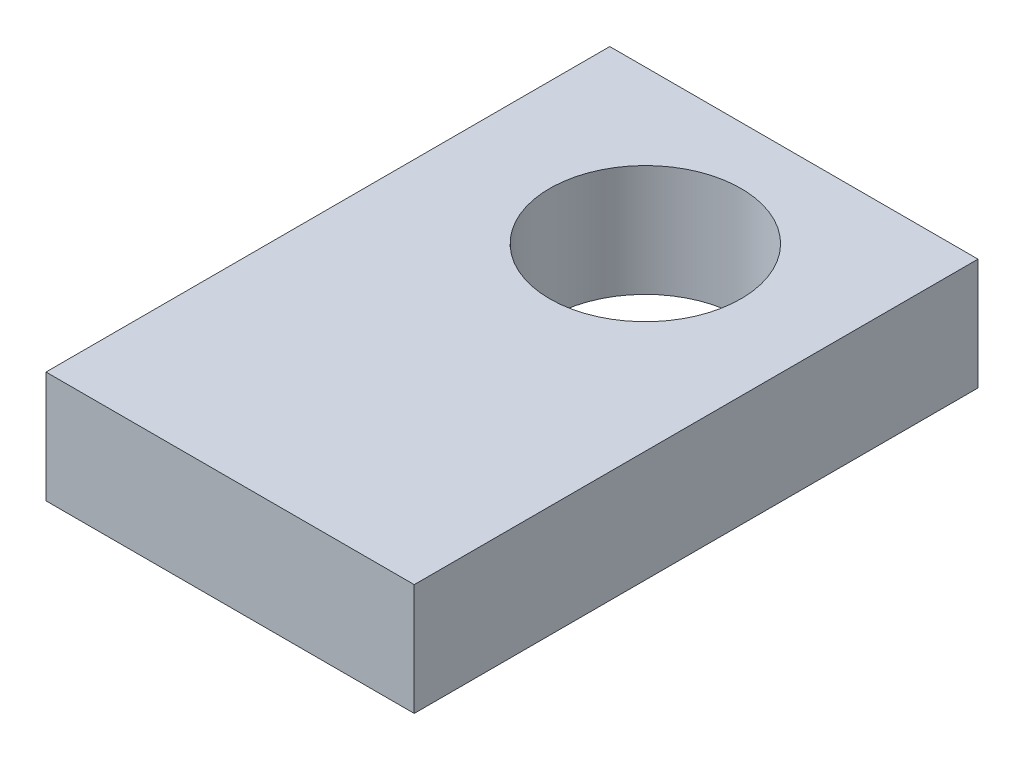
ISO-10303-21;
HEADER;
FILE_DESCRIPTION(('STEP AP214'),'2;1');
FILE_NAME('part.step','',(''),(''),'','','');
FILE_SCHEMA(('AUTOMOTIVE_DESIGN { 1 0 10303 214 1 1 1 1 }'));
ENDSEC;
DATA;
#1=APPLICATION_CONTEXT('core data for automotive mechanical design processes');
#2=APPLICATION_PROTOCOL_DEFINITION('international standard','automotive_design',2000,#1);
#3=PRODUCT_CONTEXT('',#1,'mechanical');
#4=PRODUCT('Part','Part','',(#3));
#5=PRODUCT_RELATED_PRODUCT_CATEGORY('part','',(#4));
#6=PRODUCT_DEFINITION_FORMATION('','',#4);
#7=PRODUCT_DEFINITION_CONTEXT('part definition',#1,'design');
#8=PRODUCT_DEFINITION('design','',#6,#7);
#9=PRODUCT_DEFINITION_SHAPE('','',#8);
#10=(LENGTH_UNIT() NAMED_UNIT(*) SI_UNIT(.MILLI.,.METRE.));
#11=(NAMED_UNIT(*) PLANE_ANGLE_UNIT() SI_UNIT($,.RADIAN.));
#12=(NAMED_UNIT(*) SI_UNIT($,.STERADIAN.) SOLID_ANGLE_UNIT());
#13=UNCERTAINTY_MEASURE_WITH_UNIT(LENGTH_MEASURE(1.E-05),#10,'distance_accuracy_value','');
#14=(GEOMETRIC_REPRESENTATION_CONTEXT(3) GLOBAL_UNCERTAINTY_ASSIGNED_CONTEXT((#13)) GLOBAL_UNIT_ASSIGNED_CONTEXT((#10,
#11,#12)) REPRESENTATION_CONTEXT('',''));
#15=CARTESIAN_POINT('',(0.,0.,0.));
#16=DIRECTION('',(0.,0.,1.));
#17=DIRECTION('',(1.,0.,0.));
#18=AXIS2_PLACEMENT_3D('',#15,#16,#17);
#19=CARTESIAN_POINT('',(-20.6461237463421,14.,-36.1818208227974));
#20=DIRECTION('',(1.,0.,0.));
#21=DIRECTION('',(0.,0.,-1.));
#22=AXIS2_PLACEMENT_3D('',#19,#20,#21);
#23=PLANE('',#22);
#24=DIRECTION('',(0.,0.,1.));
#25=VECTOR('',#24,1.);
#26=CARTESIAN_POINT('',(-20.6461237463421,0.,-36.1818208227974));
#27=LINE('',#26,#25);
#28=CARTESIAN_POINT('',(-20.6461237463421,0.,-36.1818208227974));
#29=VERTEX_POINT('',#28);
#30=CARTESIAN_POINT('',(-20.6461237463421,0.,34.5464842884337));
#31=VERTEX_POINT('',#30);
#32=EDGE_CURVE('E109',#29,#31,#27,.T.);
#33=ORIENTED_EDGE('',*,*,#32,.T.);
#34=DIRECTION('',(0.,-1.,0.));
#35=VECTOR('',#34,1.);
#36=CARTESIAN_POINT('',(-20.6461237463421,14.,34.5464842884337));
#37=LINE('',#36,#35);
#38=CARTESIAN_POINT('',(-20.6461237463421,14.,34.5464842884337));
#39=VERTEX_POINT('',#38);
#40=EDGE_CURVE('E11',#39,#31,#37,.T.);
#41=ORIENTED_EDGE('',*,*,#40,.F.);
#42=DIRECTION('',(0.,0.,1.));
#43=VECTOR('',#42,1.);
#44=CARTESIAN_POINT('',(-20.6461237463421,14.,-36.1818208227974));
#45=LINE('',#44,#43);
#46=CARTESIAN_POINT('',(-20.6461237463421,14.,-36.1818208227974));
#47=VERTEX_POINT('',#46);
#48=EDGE_CURVE('E93',#47,#39,#45,.T.);
#49=ORIENTED_EDGE('',*,*,#48,.F.);
#50=DIRECTION('',(0.,-1.,0.));
#51=VECTOR('',#50,1.);
#52=CARTESIAN_POINT('',(-20.6461237463421,14.,-36.1818208227974));
#53=LINE('',#52,#51);
#54=EDGE_CURVE('E105',#47,#29,#53,.T.);
#55=ORIENTED_EDGE('',*,*,#54,.T.);
#56=EDGE_LOOP('',(#33,#41,#49,#55));
#57=FACE_BOUND('',#56,.T.);
#58=ADVANCED_FACE('F41',(#57),#23,.F.);
#59=CARTESIAN_POINT('',(-20.6461237463421,14.,34.5464842884337));
#60=DIRECTION('',(0.,0.,-1.));
#61=DIRECTION('',(-1.,0.,0.));
#62=AXIS2_PLACEMENT_3D('',#59,#60,#61);
#63=PLANE('',#62);
#64=DIRECTION('',(1.,0.,0.));
#65=VECTOR('',#64,1.);
#66=CARTESIAN_POINT('',(-20.6461237463421,0.,34.5464842884337));
#67=LINE('',#66,#65);
#68=CARTESIAN_POINT('',(25.5521333494332,0.,34.5464842884337));
#69=VERTEX_POINT('',#68);
#70=EDGE_CURVE('E98',#31,#69,#67,.T.);
#71=ORIENTED_EDGE('',*,*,#70,.T.);
#72=DIRECTION('',(0.,-1.,0.));
#73=VECTOR('',#72,1.);
#74=CARTESIAN_POINT('',(25.5521333494332,14.,34.5464842884337));
#75=LINE('',#74,#73);
#76=CARTESIAN_POINT('',(25.5521333494332,14.,34.5464842884337));
#77=VERTEX_POINT('',#76);
#78=EDGE_CURVE('E50',#77,#69,#75,.T.);
#79=ORIENTED_EDGE('',*,*,#78,.F.);
#80=DIRECTION('',(1.,0.,0.));
#81=VECTOR('',#80,1.);
#82=CARTESIAN_POINT('',(-20.6461237463421,14.,34.5464842884337));
#83=LINE('',#82,#81);
#84=EDGE_CURVE('E88',#39,#77,#83,.T.);
#85=ORIENTED_EDGE('',*,*,#84,.F.);
#86=ORIENTED_EDGE('',*,*,#40,.T.);
#87=EDGE_LOOP('',(#71,#79,#85,#86));
#88=FACE_BOUND('',#87,.T.);
#89=ADVANCED_FACE('F97',(#88),#63,.F.);
#90=CARTESIAN_POINT('',(25.5521333494332,14.,-36.1818208227974));
#91=DIRECTION('',(-1.,0.,0.));
#92=DIRECTION('',(0.,0.,1.));
#93=AXIS2_PLACEMENT_3D('',#90,#91,#92);
#94=PLANE('',#93);
#95=DIRECTION('',(0.,0.,-1.));
#96=VECTOR('',#95,1.);
#97=CARTESIAN_POINT('',(25.5521333494332,0.,-36.1818208227974));
#98=LINE('',#97,#96);
#99=CARTESIAN_POINT('',(25.5521333494332,0.,-36.1818208227974));
#100=VERTEX_POINT('',#99);
#101=EDGE_CURVE('E75',#69,#100,#98,.T.);
#102=ORIENTED_EDGE('',*,*,#101,.T.);
#103=DIRECTION('',(0.,-1.,0.));
#104=VECTOR('',#103,1.);
#105=CARTESIAN_POINT('',(25.5521333494332,14.,-36.1818208227974));
#106=LINE('',#105,#104);
#107=CARTESIAN_POINT('',(25.5521333494332,14.,-36.1818208227974));
#108=VERTEX_POINT('',#107);
#109=EDGE_CURVE('E100',#108,#100,#106,.T.);
#110=ORIENTED_EDGE('',*,*,#109,.F.);
#111=DIRECTION('',(0.,0.,-1.));
#112=VECTOR('',#111,1.);
#113=CARTESIAN_POINT('',(25.5521333494332,14.,-36.1818208227974));
#114=LINE('',#113,#112);
#115=EDGE_CURVE('E91',#77,#108,#114,.T.);
#116=ORIENTED_EDGE('',*,*,#115,.F.);
#117=ORIENTED_EDGE('',*,*,#78,.T.);
#118=EDGE_LOOP('',(#102,#110,#116,#117));
#119=FACE_BOUND('',#118,.T.);
#120=ADVANCED_FACE('F101',(#119),#94,.F.);
#121=CARTESIAN_POINT('',(-20.6461237463421,14.,-36.1818208227974));
#122=DIRECTION('',(0.,0.,1.));
#123=DIRECTION('',(1.,0.,0.));
#124=AXIS2_PLACEMENT_3D('',#121,#122,#123);
#125=PLANE('',#124);
#126=DIRECTION('',(-1.,0.,0.));
#127=VECTOR('',#126,1.);
#128=CARTESIAN_POINT('',(-20.6461237463421,0.,-36.1818208227974));
#129=LINE('',#128,#127);
#130=EDGE_CURVE('E81',#100,#29,#129,.T.);
#131=ORIENTED_EDGE('',*,*,#130,.T.);
#132=ORIENTED_EDGE('',*,*,#54,.F.);
#133=DIRECTION('',(-1.,0.,0.));
#134=VECTOR('',#133,1.);
#135=CARTESIAN_POINT('',(-20.6461237463421,14.,-36.1818208227974));
#136=LINE('',#135,#134);
#137=EDGE_CURVE('E58',#108,#47,#136,.T.);
#138=ORIENTED_EDGE('',*,*,#137,.F.);
#139=ORIENTED_EDGE('',*,*,#109,.T.);
#140=EDGE_LOOP('',(#131,#132,#138,#139));
#141=FACE_BOUND('',#140,.T.);
#142=ADVANCED_FACE('F123',(#141),#125,.F.);
#143=CARTESIAN_POINT('',(0.,14.,0.));
#144=DIRECTION('',(0.,1.,0.));
#145=DIRECTION('',(0.,0.,1.));
#146=AXIS2_PLACEMENT_3D('',#143,#144,#145);
#147=PLANE('',#146);
#148=CARTESIAN_POINT('',(3.,14.,-17.));
#149=DIRECTION('',(0.,1.,0.));
#150=DIRECTION('',(0.,0.,1.));
#151=AXIS2_PLACEMENT_3D('',#148,#149,#150);
#152=CIRCLE('',#151,12.);
#153=CARTESIAN_POINT('',(3.,14.,-5.));
#154=VERTEX_POINT('',#153);
#155=EDGE_CURVE('E113',#154,#154,#152,.F.);
#156=ORIENTED_EDGE('',*,*,#155,.T.);
#157=EDGE_LOOP('',(#156));
#158=FACE_BOUND('',#157,.T.);
#159=ORIENTED_EDGE('',*,*,#48,.T.);
#160=ORIENTED_EDGE('',*,*,#84,.T.);
#161=ORIENTED_EDGE('',*,*,#115,.T.);
#162=ORIENTED_EDGE('',*,*,#137,.T.);
#163=EDGE_LOOP('',(#159,#160,#161,#162));
#164=FACE_BOUND('',#163,.T.);
#165=ADVANCED_FACE('F89',(#158,#164),#147,.T.);
#166=CARTESIAN_POINT('',(0.,0.,0.));
#167=DIRECTION('',(0.,1.,0.));
#168=DIRECTION('',(0.,0.,1.));
#169=AXIS2_PLACEMENT_3D('',#166,#167,#168);
#170=PLANE('',#169);
#171=CARTESIAN_POINT('',(3.,0.,-17.));
#172=DIRECTION('',(0.,1.,0.));
#173=DIRECTION('',(0.,0.,1.));
#174=AXIS2_PLACEMENT_3D('',#171,#172,#173);
#175=CIRCLE('',#174,12.);
#176=CARTESIAN_POINT('',(3.,0.,-5.));
#177=VERTEX_POINT('',#176);
#178=EDGE_CURVE('E133',#177,#177,#175,.T.);
#179=ORIENTED_EDGE('',*,*,#178,.T.);
#180=EDGE_LOOP('',(#179));
#181=FACE_BOUND('',#180,.T.);
#182=ORIENTED_EDGE('',*,*,#32,.F.);
#183=ORIENTED_EDGE('',*,*,#130,.F.);
#184=ORIENTED_EDGE('',*,*,#101,.F.);
#185=ORIENTED_EDGE('',*,*,#70,.F.);
#186=EDGE_LOOP('',(#182,#183,#184,#185));
#187=FACE_BOUND('',#186,.T.);
#188=ADVANCED_FACE('F126',(#181,#187),#170,.F.);
#189=CARTESIAN_POINT('',(3.,15.,-17.));
#190=DIRECTION('',(0.,-1.,0.));
#191=DIRECTION('',(0.,0.,-1.));
#192=AXIS2_PLACEMENT_3D('',#189,#190,#191);
#193=CYLINDRICAL_SURFACE('',#192,12.);
#194=ORIENTED_EDGE('',*,*,#155,.F.);
#195=EDGE_LOOP('',(#194));
#196=FACE_BOUND('',#195,.T.);
#197=ORIENTED_EDGE('',*,*,#178,.F.);
#198=EDGE_LOOP('',(#197));
#199=FACE_BOUND('',#198,.T.);
#200=ADVANCED_FACE('F139',(#196,#199),#193,.F.);
#201=CLOSED_SHELL('',(#58,#89,#120,#142,#165,#188,#200));
#202=MANIFOLD_SOLID_BREP('B2',#201);
#203=ADVANCED_BREP_SHAPE_REPRESENTATION('',(#18,#202),#14);
#204=SHAPE_DEFINITION_REPRESENTATION(#9,#203);
ENDSEC;
END-ISO-10303-21;
